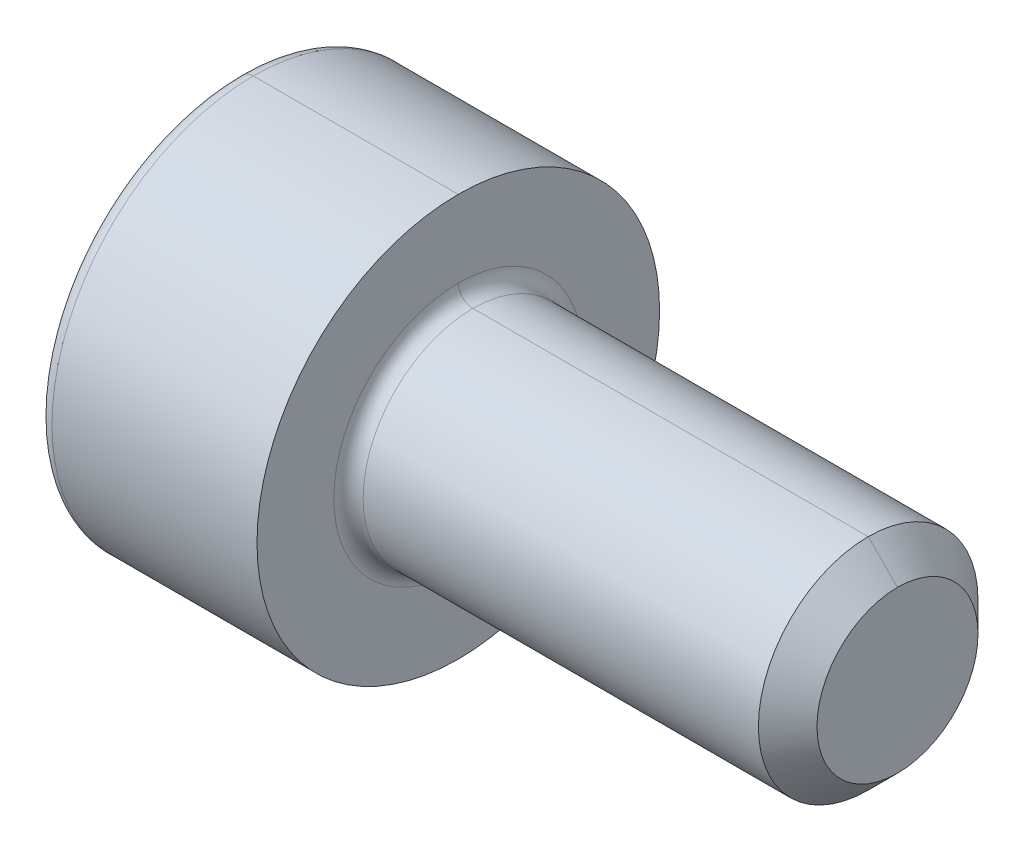
ISO-10303-21;
HEADER;
FILE_DESCRIPTION(('STEP AP214'),'2;1');
FILE_NAME('part.step','',(''),(''),'','','');
FILE_SCHEMA(('AUTOMOTIVE_DESIGN { 1 0 10303 214 1 1 1 1 }'));
ENDSEC;
DATA;
#1=APPLICATION_CONTEXT('core data for automotive mechanical design processes');
#2=APPLICATION_PROTOCOL_DEFINITION('international standard','automotive_design',2000,#1);
#3=PRODUCT_CONTEXT('',#1,'mechanical');
#4=PRODUCT('Part','Part','',(#3));
#5=PRODUCT_RELATED_PRODUCT_CATEGORY('part','',(#4));
#6=PRODUCT_DEFINITION_FORMATION('','',#4);
#7=PRODUCT_DEFINITION_CONTEXT('part definition',#1,'design');
#8=PRODUCT_DEFINITION('design','',#6,#7);
#9=PRODUCT_DEFINITION_SHAPE('','',#8);
#10=(LENGTH_UNIT() NAMED_UNIT(*) SI_UNIT(.MILLI.,.METRE.));
#11=(NAMED_UNIT(*) PLANE_ANGLE_UNIT() SI_UNIT($,.RADIAN.));
#12=(NAMED_UNIT(*) SI_UNIT($,.STERADIAN.) SOLID_ANGLE_UNIT());
#13=UNCERTAINTY_MEASURE_WITH_UNIT(LENGTH_MEASURE(1.E-05),#10,'distance_accuracy_value','');
#14=(GEOMETRIC_REPRESENTATION_CONTEXT(3) GLOBAL_UNCERTAINTY_ASSIGNED_CONTEXT((#13)) GLOBAL_UNIT_ASSIGNED_CONTEXT((#10,
#11,#12)) REPRESENTATION_CONTEXT('',''));
#15=CARTESIAN_POINT('',(0.,0.,0.));
#16=DIRECTION('',(0.,0.,1.));
#17=DIRECTION('',(1.,0.,0.));
#18=AXIS2_PLACEMENT_3D('',#15,#16,#17);
#19=CARTESIAN_POINT('',(1.5,0.,0.));
#20=DIRECTION('',(-1.,0.,0.));
#21=DIRECTION('',(0.,1.,0.));
#22=AXIS2_PLACEMENT_3D('',#19,#20,#21);
#23=PLANE('',#22);
#24=DIRECTION('',(0.,-0.866025403784438,0.5));
#25=VECTOR('',#24,1.);
#26=CARTESIAN_POINT('',(1.5,0.,-1.44337567297406));
#27=LINE('',#26,#25);
#28=CARTESIAN_POINT('',(1.5,0.,-1.44337567297406));
#29=VERTEX_POINT('',#28);
#30=CARTESIAN_POINT('',(1.5,-1.25,-0.721687836487032));
#31=VERTEX_POINT('',#30);
#32=EDGE_CURVE('E286',#29,#31,#27,.T.);
#33=ORIENTED_EDGE('',*,*,#32,.T.);
#34=DIRECTION('',(0.,0.,1.));
#35=VECTOR('',#34,1.);
#36=CARTESIAN_POINT('',(1.5,-1.25,-0.721687836487032));
#37=LINE('',#36,#35);
#38=CARTESIAN_POINT('',(1.5,-1.25,0.721687836487032));
#39=VERTEX_POINT('',#38);
#40=EDGE_CURVE('E11',#31,#39,#37,.T.);
#41=ORIENTED_EDGE('',*,*,#40,.T.);
#42=DIRECTION('',(0.,0.866025403784439,0.5));
#43=VECTOR('',#42,1.);
#44=CARTESIAN_POINT('',(1.5,-1.25,0.721687836487032));
#45=LINE('',#44,#43);
#46=CARTESIAN_POINT('',(1.5,0.,1.44337567297406));
#47=VERTEX_POINT('',#46);
#48=EDGE_CURVE('E45',#39,#47,#45,.T.);
#49=ORIENTED_EDGE('',*,*,#48,.T.);
#50=DIRECTION('',(0.,0.866025403784438,-0.5));
#51=VECTOR('',#50,1.);
#52=CARTESIAN_POINT('',(1.5,0.,1.44337567297406));
#53=LINE('',#52,#51);
#54=CARTESIAN_POINT('',(1.5,1.25,0.721687836487032));
#55=VERTEX_POINT('',#54);
#56=EDGE_CURVE('E196',#47,#55,#53,.T.);
#57=ORIENTED_EDGE('',*,*,#56,.T.);
#58=DIRECTION('',(0.,0.,-1.));
#59=VECTOR('',#58,1.);
#60=CARTESIAN_POINT('',(1.5,1.25,0.721687836487032));
#61=LINE('',#60,#59);
#62=CARTESIAN_POINT('',(1.5,1.25,-0.721687836487032));
#63=VERTEX_POINT('',#62);
#64=EDGE_CURVE('E232',#55,#63,#61,.T.);
#65=ORIENTED_EDGE('',*,*,#64,.T.);
#66=DIRECTION('',(0.,-0.866025403784439,-0.5));
#67=VECTOR('',#66,1.);
#68=CARTESIAN_POINT('',(1.5,1.25,-0.721687836487032));
#69=LINE('',#68,#67);
#70=EDGE_CURVE('E233',#63,#29,#69,.T.);
#71=ORIENTED_EDGE('',*,*,#70,.T.);
#72=EDGE_LOOP('',(#33,#41,#49,#57,#65,#71));
#73=FACE_BOUND('',#72,.T.);
#74=ADVANCED_FACE('F17',(#73),#23,.T.);
#75=CARTESIAN_POINT('',(1.5,-1.25,-0.721687836487032));
#76=DIRECTION('',(0.,-1.,0.));
#77=DIRECTION('',(0.,0.,-1.));
#78=AXIS2_PLACEMENT_3D('',#75,#76,#77);
#79=PLANE('',#78);
#80=DIRECTION('',(0.,0.,1.));
#81=VECTOR('',#80,1.);
#82=CARTESIAN_POINT('',(0.,-1.25,-0.721687836487032));
#83=LINE('',#82,#81);
#84=CARTESIAN_POINT('',(0.,-1.25,-0.721687836487032));
#85=VERTEX_POINT('',#84);
#86=CARTESIAN_POINT('',(0.,-1.25,0.721687836487032));
#87=VERTEX_POINT('',#86);
#88=EDGE_CURVE('E159',#85,#87,#83,.T.);
#89=ORIENTED_EDGE('',*,*,#88,.T.);
#90=DIRECTION('',(-1.,0.,0.));
#91=VECTOR('',#90,1.);
#92=CARTESIAN_POINT('',(1.5,-1.25,0.721687836487032));
#93=LINE('',#92,#91);
#94=EDGE_CURVE('E20',#39,#87,#93,.T.);
#95=ORIENTED_EDGE('',*,*,#94,.F.);
#96=ORIENTED_EDGE('',*,*,#40,.F.);
#97=DIRECTION('',(-1.,0.,0.));
#98=VECTOR('',#97,1.);
#99=CARTESIAN_POINT('',(1.5,-1.25,-0.721687836487032));
#100=LINE('',#99,#98);
#101=EDGE_CURVE('E283',#31,#85,#100,.T.);
#102=ORIENTED_EDGE('',*,*,#101,.T.);
#103=EDGE_LOOP('',(#89,#95,#96,#102));
#104=FACE_BOUND('',#103,.T.);
#105=ADVANCED_FACE('F313',(#104),#79,.F.);
#106=CARTESIAN_POINT('',(1.5,-1.25,0.721687836487032));
#107=DIRECTION('',(0.,-0.5,0.866025403784439));
#108=DIRECTION('',(-1.,0.,0.));
#109=AXIS2_PLACEMENT_3D('',#106,#107,#108);
#110=PLANE('',#109);
#111=DIRECTION('',(0.,0.866025403784439,0.5));
#112=VECTOR('',#111,1.);
#113=CARTESIAN_POINT('',(0.,-1.25,0.721687836487032));
#114=LINE('',#113,#112);
#115=CARTESIAN_POINT('',(0.,0.,1.44337567297406));
#116=VERTEX_POINT('',#115);
#117=EDGE_CURVE('E265',#87,#116,#114,.T.);
#118=ORIENTED_EDGE('',*,*,#117,.T.);
#119=DIRECTION('',(-1.,0.,0.));
#120=VECTOR('',#119,1.);
#121=CARTESIAN_POINT('',(1.5,0.,1.44337567297406));
#122=LINE('',#121,#120);
#123=EDGE_CURVE('E194',#47,#116,#122,.T.);
#124=ORIENTED_EDGE('',*,*,#123,.F.);
#125=ORIENTED_EDGE('',*,*,#48,.F.);
#126=ORIENTED_EDGE('',*,*,#94,.T.);
#127=EDGE_LOOP('',(#118,#124,#125,#126));
#128=FACE_BOUND('',#127,.T.);
#129=ADVANCED_FACE('F308',(#128),#110,.F.);
#130=CARTESIAN_POINT('',(1.5,0.,1.44337567297406));
#131=DIRECTION('',(0.,0.5,0.866025403784438));
#132=DIRECTION('',(1.,0.,0.));
#133=AXIS2_PLACEMENT_3D('',#130,#131,#132);
#134=PLANE('',#133);
#135=DIRECTION('',(0.,0.866025403784438,-0.5));
#136=VECTOR('',#135,1.);
#137=CARTESIAN_POINT('',(0.,0.,1.44337567297406));
#138=LINE('',#137,#136);
#139=CARTESIAN_POINT('',(0.,1.25,0.721687836487032));
#140=VERTEX_POINT('',#139);
#141=EDGE_CURVE('E261',#116,#140,#138,.T.);
#142=ORIENTED_EDGE('',*,*,#141,.T.);
#143=DIRECTION('',(-1.,0.,0.));
#144=VECTOR('',#143,1.);
#145=CARTESIAN_POINT('',(1.5,1.25,0.721687836487032));
#146=LINE('',#145,#144);
#147=EDGE_CURVE('E295',#55,#140,#146,.T.);
#148=ORIENTED_EDGE('',*,*,#147,.F.);
#149=ORIENTED_EDGE('',*,*,#56,.F.);
#150=ORIENTED_EDGE('',*,*,#123,.T.);
#151=EDGE_LOOP('',(#142,#148,#149,#150));
#152=FACE_BOUND('',#151,.T.);
#153=ADVANCED_FACE('F323',(#152),#134,.F.);
#154=CARTESIAN_POINT('',(1.5,1.25,0.721687836487032));
#155=DIRECTION('',(0.,1.,0.));
#156=DIRECTION('',(1.,0.,0.));
#157=AXIS2_PLACEMENT_3D('',#154,#155,#156);
#158=PLANE('',#157);
#159=DIRECTION('',(0.,0.,-1.));
#160=VECTOR('',#159,1.);
#161=CARTESIAN_POINT('',(0.,1.25,0.721687836487032));
#162=LINE('',#161,#160);
#163=CARTESIAN_POINT('',(0.,1.25,-0.721687836487032));
#164=VERTEX_POINT('',#163);
#165=EDGE_CURVE('E257',#140,#164,#162,.T.);
#166=ORIENTED_EDGE('',*,*,#165,.T.);
#167=DIRECTION('',(-1.,0.,0.));
#168=VECTOR('',#167,1.);
#169=CARTESIAN_POINT('',(1.5,1.25,-0.721687836487032));
#170=LINE('',#169,#168);
#171=EDGE_CURVE('E229',#63,#164,#170,.T.);
#172=ORIENTED_EDGE('',*,*,#171,.F.);
#173=ORIENTED_EDGE('',*,*,#64,.F.);
#174=ORIENTED_EDGE('',*,*,#147,.T.);
#175=EDGE_LOOP('',(#166,#172,#173,#174));
#176=FACE_BOUND('',#175,.T.);
#177=ADVANCED_FACE('F330',(#176),#158,.F.);
#178=CARTESIAN_POINT('',(1.5,1.25,-0.721687836487032));
#179=DIRECTION('',(0.,0.5,-0.866025403784439));
#180=DIRECTION('',(-1.,0.,0.));
#181=AXIS2_PLACEMENT_3D('',#178,#179,#180);
#182=PLANE('',#181);
#183=DIRECTION('',(0.,-0.866025403784439,-0.5));
#184=VECTOR('',#183,1.);
#185=CARTESIAN_POINT('',(0.,1.25,-0.721687836487032));
#186=LINE('',#185,#184);
#187=CARTESIAN_POINT('',(0.,0.,-1.44337567297406));
#188=VERTEX_POINT('',#187);
#189=EDGE_CURVE('E253',#164,#188,#186,.T.);
#190=ORIENTED_EDGE('',*,*,#189,.T.);
#191=DIRECTION('',(-1.,0.,0.));
#192=VECTOR('',#191,1.);
#193=CARTESIAN_POINT('',(1.5,0.,-1.44337567297406));
#194=LINE('',#193,#192);
#195=EDGE_CURVE('E289',#29,#188,#194,.T.);
#196=ORIENTED_EDGE('',*,*,#195,.F.);
#197=ORIENTED_EDGE('',*,*,#70,.F.);
#198=ORIENTED_EDGE('',*,*,#171,.T.);
#199=EDGE_LOOP('',(#190,#196,#197,#198));
#200=FACE_BOUND('',#199,.T.);
#201=ADVANCED_FACE('F332',(#200),#182,.F.);
#202=CARTESIAN_POINT('',(1.5,0.,-1.44337567297406));
#203=DIRECTION('',(0.,-0.5,-0.866025403784438));
#204=DIRECTION('',(0.,-0.866025403784438,0.5));
#205=AXIS2_PLACEMENT_3D('',#202,#203,#204);
#206=PLANE('',#205);
#207=DIRECTION('',(0.,-0.866025403784438,0.5));
#208=VECTOR('',#207,1.);
#209=CARTESIAN_POINT('',(0.,0.,-1.44337567297406));
#210=LINE('',#209,#208);
#211=EDGE_CURVE('E249',#188,#85,#210,.T.);
#212=ORIENTED_EDGE('',*,*,#211,.T.);
#213=ORIENTED_EDGE('',*,*,#101,.F.);
#214=ORIENTED_EDGE('',*,*,#32,.F.);
#215=ORIENTED_EDGE('',*,*,#195,.T.);
#216=EDGE_LOOP('',(#212,#213,#214,#215));
#217=FACE_BOUND('',#216,.T.);
#218=ADVANCED_FACE('F335',(#217),#206,.F.);
#219=CARTESIAN_POINT('',(9.,1.1,0.));
#220=DIRECTION('',(1.,0.,0.));
#221=DIRECTION('',(0.,-1.,0.));
#222=AXIS2_PLACEMENT_3D('',#219,#220,#221);
#223=PLANE('',#222);
#224=CARTESIAN_POINT('',(9.,0.,0.));
#225=DIRECTION('',(1.,0.,0.));
#226=DIRECTION('',(0.,1.,0.));
#227=AXIS2_PLACEMENT_3D('',#224,#225,#226);
#228=CIRCLE('',#227,1.1);
#229=CARTESIAN_POINT('',(9.,-1.1,0.));
#230=VERTEX_POINT('',#229);
#231=CARTESIAN_POINT('',(9.,1.1,0.));
#232=VERTEX_POINT('',#231);
#233=EDGE_CURVE('E280',#230,#232,#228,.T.);
#234=ORIENTED_EDGE('',*,*,#233,.T.);
#235=CARTESIAN_POINT('',(9.,0.,0.));
#236=DIRECTION('',(1.,0.,0.));
#237=DIRECTION('',(0.,1.,0.));
#238=AXIS2_PLACEMENT_3D('',#235,#236,#237);
#239=CIRCLE('',#238,1.1);
#240=EDGE_CURVE('E203',#232,#230,#239,.T.);
#241=ORIENTED_EDGE('',*,*,#240,.T.);
#242=EDGE_LOOP('',(#234,#241));
#243=FACE_BOUND('',#242,.T.);
#244=ADVANCED_FACE('F337',(#243),#223,.T.);
#245=CARTESIAN_POINT('',(9.,0.,0.));
#246=DIRECTION('',(-1.,0.,0.));
#247=DIRECTION('',(0.,-1.,0.));
#248=AXIS2_PLACEMENT_3D('',#245,#246,#247);
#249=CONICAL_SURFACE('',#248,1.1,0.785398163397449);
#250=DIRECTION('',(-0.707106781186547,0.707106781186548,0.));
#251=VECTOR('',#250,1.);
#252=CARTESIAN_POINT('',(9.,1.1,0.));
#253=LINE('',#252,#251);
#254=CARTESIAN_POINT('',(8.6,1.5,0.));
#255=VERTEX_POINT('',#254);
#256=EDGE_CURVE('E207',#232,#255,#253,.T.);
#257=ORIENTED_EDGE('',*,*,#256,.F.);
#258=ORIENTED_EDGE('',*,*,#233,.F.);
#259=DIRECTION('',(-0.707106781186547,-0.707106781186548,0.));
#260=VECTOR('',#259,1.);
#261=CARTESIAN_POINT('',(9.,-1.1,0.));
#262=LINE('',#261,#260);
#263=CARTESIAN_POINT('',(8.6,-1.5,0.));
#264=VERTEX_POINT('',#263);
#265=EDGE_CURVE('E217',#230,#264,#262,.T.);
#266=ORIENTED_EDGE('',*,*,#265,.T.);
#267=CARTESIAN_POINT('',(8.6,0.,0.));
#268=DIRECTION('',(1.,0.,0.));
#269=DIRECTION('',(0.,1.,0.));
#270=AXIS2_PLACEMENT_3D('',#267,#268,#269);
#271=CIRCLE('',#270,1.5);
#272=EDGE_CURVE('E277',#264,#255,#271,.T.);
#273=ORIENTED_EDGE('',*,*,#272,.T.);
#274=EDGE_LOOP('',(#257,#258,#266,#273));
#275=FACE_BOUND('',#274,.T.);
#276=ADVANCED_FACE('F344',(#275),#249,.T.);
#277=CARTESIAN_POINT('',(9.,0.,0.));
#278=DIRECTION('',(1.,0.,0.));
#279=DIRECTION('',(0.,1.,0.));
#280=AXIS2_PLACEMENT_3D('',#277,#278,#279);
#281=CYLINDRICAL_SURFACE('',#280,1.5);
#282=DIRECTION('',(1.,0.,0.));
#283=VECTOR('',#282,1.);
#284=CARTESIAN_POINT('',(9.,-1.5,0.));
#285=LINE('',#284,#283);
#286=CARTESIAN_POINT('',(3.2,-1.5,0.));
#287=VERTEX_POINT('',#286);
#288=EDGE_CURVE('E197',#287,#264,#285,.T.);
#289=ORIENTED_EDGE('',*,*,#288,.F.);
#290=CARTESIAN_POINT('',(3.2,0.,0.));
#291=DIRECTION('',(1.,0.,0.));
#292=DIRECTION('',(0.,1.,0.));
#293=AXIS2_PLACEMENT_3D('',#290,#291,#292);
#294=CIRCLE('',#293,1.5);
#295=CARTESIAN_POINT('',(3.2,1.5,0.));
#296=VERTEX_POINT('',#295);
#297=EDGE_CURVE('E218',#287,#296,#294,.T.);
#298=ORIENTED_EDGE('',*,*,#297,.T.);
#299=DIRECTION('',(1.,0.,0.));
#300=VECTOR('',#299,1.);
#301=CARTESIAN_POINT('',(9.,1.5,0.));
#302=LINE('',#301,#300);
#303=EDGE_CURVE('E201',#296,#255,#302,.T.);
#304=ORIENTED_EDGE('',*,*,#303,.T.);
#305=ORIENTED_EDGE('',*,*,#272,.F.);
#306=EDGE_LOOP('',(#289,#298,#304,#305));
#307=FACE_BOUND('',#306,.T.);
#308=ADVANCED_FACE('F381',(#307),#281,.T.);
#309=CARTESIAN_POINT('',(3.2,0.,0.));
#310=DIRECTION('',(1.,0.,0.));
#311=DIRECTION('',(0.,1.,0.));
#312=AXIS2_PLACEMENT_3D('',#309,#310,#311);
#313=TOROIDAL_SURFACE('',#312,1.7,0.2);
#314=CARTESIAN_POINT('',(3.2,-1.7,0.));
#315=DIRECTION('',(0.,0.,1.));
#316=DIRECTION('',(0.,-1.,0.));
#317=AXIS2_PLACEMENT_3D('',#314,#315,#316);
#318=CIRCLE('',#317,0.2);
#319=CARTESIAN_POINT('',(3.,-1.7,0.));
#320=VERTEX_POINT('',#319);
#321=EDGE_CURVE('E221',#287,#320,#318,.T.);
#322=ORIENTED_EDGE('',*,*,#321,.F.);
#323=CARTESIAN_POINT('',(3.2,0.,0.));
#324=DIRECTION('',(1.,0.,0.));
#325=DIRECTION('',(0.,1.,0.));
#326=AXIS2_PLACEMENT_3D('',#323,#324,#325);
#327=CIRCLE('',#326,1.5);
#328=EDGE_CURVE('E202',#296,#287,#327,.T.);
#329=ORIENTED_EDGE('',*,*,#328,.F.);
#330=CARTESIAN_POINT('',(3.2,1.7,0.));
#331=DIRECTION('',(0.,0.,-1.));
#332=DIRECTION('',(-1.,0.,0.));
#333=AXIS2_PLACEMENT_3D('',#330,#331,#332);
#334=CIRCLE('',#333,0.2);
#335=CARTESIAN_POINT('',(3.,1.7,0.));
#336=VERTEX_POINT('',#335);
#337=EDGE_CURVE('E182',#296,#336,#334,.T.);
#338=ORIENTED_EDGE('',*,*,#337,.T.);
#339=CARTESIAN_POINT('',(3.,0.,0.));
#340=DIRECTION('',(1.,0.,0.));
#341=DIRECTION('',(0.,1.,0.));
#342=AXIS2_PLACEMENT_3D('',#339,#340,#341);
#343=CIRCLE('',#342,1.7);
#344=EDGE_CURVE('E274',#336,#320,#343,.T.);
#345=ORIENTED_EDGE('',*,*,#344,.T.);
#346=EDGE_LOOP('',(#322,#329,#338,#345));
#347=FACE_BOUND('',#346,.T.);
#348=ADVANCED_FACE('F374',(#347),#313,.F.);
#349=CARTESIAN_POINT('',(3.,2.75,0.));
#350=DIRECTION('',(1.,0.,0.));
#351=DIRECTION('',(0.,-1.,0.));
#352=AXIS2_PLACEMENT_3D('',#349,#350,#351);
#353=PLANE('',#352);
#354=ORIENTED_EDGE('',*,*,#344,.F.);
#355=CARTESIAN_POINT('',(3.,0.,0.));
#356=DIRECTION('',(1.,0.,0.));
#357=DIRECTION('',(0.,1.,0.));
#358=AXIS2_PLACEMENT_3D('',#355,#356,#357);
#359=CIRCLE('',#358,1.7);
#360=EDGE_CURVE('E191',#320,#336,#359,.T.);
#361=ORIENTED_EDGE('',*,*,#360,.F.);
#362=EDGE_LOOP('',(#354,#361));
#363=FACE_BOUND('',#362,.T.);
#364=CARTESIAN_POINT('',(3.,0.,0.));
#365=DIRECTION('',(1.,0.,0.));
#366=DIRECTION('',(0.,1.,0.));
#367=AXIS2_PLACEMENT_3D('',#364,#365,#366);
#368=CIRCLE('',#367,2.75);
#369=CARTESIAN_POINT('',(3.,2.75,0.));
#370=VERTEX_POINT('',#369);
#371=CARTESIAN_POINT('',(3.,-2.75,0.));
#372=VERTEX_POINT('',#371);
#373=EDGE_CURVE('E176',#370,#372,#368,.T.);
#374=ORIENTED_EDGE('',*,*,#373,.T.);
#375=CARTESIAN_POINT('',(3.,0.,0.));
#376=DIRECTION('',(1.,0.,0.));
#377=DIRECTION('',(0.,1.,0.));
#378=AXIS2_PLACEMENT_3D('',#375,#376,#377);
#379=CIRCLE('',#378,2.75);
#380=EDGE_CURVE('E158',#372,#370,#379,.T.);
#381=ORIENTED_EDGE('',*,*,#380,.T.);
#382=EDGE_LOOP('',(#374,#381));
#383=FACE_BOUND('',#382,.T.);
#384=ADVANCED_FACE('F371',(#363,#383),#353,.T.);
#385=CARTESIAN_POINT('',(9.,0.,0.));
#386=DIRECTION('',(1.,0.,0.));
#387=DIRECTION('',(0.,1.,0.));
#388=AXIS2_PLACEMENT_3D('',#385,#386,#387);
#389=CYLINDRICAL_SURFACE('',#388,2.75);
#390=DIRECTION('',(1.,0.,0.));
#391=VECTOR('',#390,1.);
#392=CARTESIAN_POINT('',(9.,-2.75,0.));
#393=LINE('',#392,#391);
#394=CARTESIAN_POINT('',(0.2,-2.75,0.));
#395=VERTEX_POINT('',#394);
#396=EDGE_CURVE('E152',#395,#372,#393,.T.);
#397=ORIENTED_EDGE('',*,*,#396,.F.);
#398=CARTESIAN_POINT('',(0.2,0.,0.));
#399=DIRECTION('',(1.,0.,0.));
#400=DIRECTION('',(0.,1.,0.));
#401=AXIS2_PLACEMENT_3D('',#398,#399,#400);
#402=CIRCLE('',#401,2.75);
#403=CARTESIAN_POINT('',(0.2,2.75,0.));
#404=VERTEX_POINT('',#403);
#405=EDGE_CURVE('E145',#395,#404,#402,.T.);
#406=ORIENTED_EDGE('',*,*,#405,.T.);
#407=DIRECTION('',(1.,0.,0.));
#408=VECTOR('',#407,1.);
#409=CARTESIAN_POINT('',(9.,2.75,0.));
#410=LINE('',#409,#408);
#411=EDGE_CURVE('E149',#404,#370,#410,.T.);
#412=ORIENTED_EDGE('',*,*,#411,.T.);
#413=ORIENTED_EDGE('',*,*,#380,.F.);
#414=EDGE_LOOP('',(#397,#406,#412,#413));
#415=FACE_BOUND('',#414,.T.);
#416=ADVANCED_FACE('F147',(#415),#389,.T.);
#417=CARTESIAN_POINT('',(0.2,0.,0.));
#418=DIRECTION('',(1.,0.,0.));
#419=DIRECTION('',(0.,1.,0.));
#420=AXIS2_PLACEMENT_3D('',#417,#418,#419);
#421=TOROIDAL_SURFACE('',#420,2.55,0.2);
#422=CARTESIAN_POINT('',(0.2,-2.55,0.));
#423=DIRECTION('',(0.,0.,1.));
#424=DIRECTION('',(0.,-1.,0.));
#425=AXIS2_PLACEMENT_3D('',#422,#423,#424);
#426=CIRCLE('',#425,0.2);
#427=CARTESIAN_POINT('',(0.,-2.55,0.));
#428=VERTEX_POINT('',#427);
#429=EDGE_CURVE('E170',#428,#395,#426,.T.);
#430=ORIENTED_EDGE('',*,*,#429,.F.);
#431=CARTESIAN_POINT('',(0.,0.,0.));
#432=DIRECTION('',(1.,0.,0.));
#433=DIRECTION('',(0.,1.,0.));
#434=AXIS2_PLACEMENT_3D('',#431,#432,#433);
#435=CIRCLE('',#434,2.55);
#436=CARTESIAN_POINT('',(0.,2.55,0.));
#437=VERTEX_POINT('',#436);
#438=EDGE_CURVE('E164',#428,#437,#435,.T.);
#439=ORIENTED_EDGE('',*,*,#438,.T.);
#440=CARTESIAN_POINT('',(0.2,2.55,0.));
#441=DIRECTION('',(0.,0.,-1.));
#442=DIRECTION('',(-1.,0.,0.));
#443=AXIS2_PLACEMENT_3D('',#440,#441,#442);
#444=CIRCLE('',#443,0.2);
#445=EDGE_CURVE('E162',#437,#404,#444,.T.);
#446=ORIENTED_EDGE('',*,*,#445,.T.);
#447=ORIENTED_EDGE('',*,*,#405,.F.);
#448=EDGE_LOOP('',(#430,#439,#446,#447));
#449=FACE_BOUND('',#448,.T.);
#450=ADVANCED_FACE('F163',(#449),#421,.T.);
#451=CARTESIAN_POINT('',(0.,0.,0.));
#452=DIRECTION('',(-1.,0.,0.));
#453=DIRECTION('',(0.,0.,1.));
#454=AXIS2_PLACEMENT_3D('',#451,#452,#453);
#455=PLANE('',#454);
#456=ORIENTED_EDGE('',*,*,#211,.F.);
#457=ORIENTED_EDGE('',*,*,#189,.F.);
#458=ORIENTED_EDGE('',*,*,#165,.F.);
#459=ORIENTED_EDGE('',*,*,#141,.F.);
#460=ORIENTED_EDGE('',*,*,#117,.F.);
#461=ORIENTED_EDGE('',*,*,#88,.F.);
#462=EDGE_LOOP('',(#456,#457,#458,#459,#460,#461));
#463=FACE_BOUND('',#462,.T.);
#464=CARTESIAN_POINT('',(0.,0.,0.));
#465=DIRECTION('',(1.,0.,0.));
#466=DIRECTION('',(0.,1.,0.));
#467=AXIS2_PLACEMENT_3D('',#464,#465,#466);
#468=CIRCLE('',#467,2.55);
#469=EDGE_CURVE('E178',#437,#428,#468,.T.);
#470=ORIENTED_EDGE('',*,*,#469,.F.);
#471=ORIENTED_EDGE('',*,*,#438,.F.);
#472=EDGE_LOOP('',(#470,#471));
#473=FACE_BOUND('',#472,.T.);
#474=ADVANCED_FACE('F317',(#463,#473),#455,.T.);
#475=CARTESIAN_POINT('',(0.2,0.,0.));
#476=DIRECTION('',(1.,0.,0.));
#477=DIRECTION('',(0.,1.,0.));
#478=AXIS2_PLACEMENT_3D('',#475,#476,#477);
#479=TOROIDAL_SURFACE('',#478,2.55,0.2);
#480=ORIENTED_EDGE('',*,*,#469,.T.);
#481=ORIENTED_EDGE('',*,*,#429,.T.);
#482=CARTESIAN_POINT('',(0.2,0.,0.));
#483=DIRECTION('',(1.,0.,0.));
#484=DIRECTION('',(0.,1.,0.));
#485=AXIS2_PLACEMENT_3D('',#482,#483,#484);
#486=CIRCLE('',#485,2.75);
#487=EDGE_CURVE('E174',#404,#395,#486,.T.);
#488=ORIENTED_EDGE('',*,*,#487,.F.);
#489=ORIENTED_EDGE('',*,*,#445,.F.);
#490=EDGE_LOOP('',(#480,#481,#488,#489));
#491=FACE_BOUND('',#490,.T.);
#492=ADVANCED_FACE('F180',(#491),#479,.T.);
#493=CARTESIAN_POINT('',(9.,0.,0.));
#494=DIRECTION('',(1.,0.,0.));
#495=DIRECTION('',(0.,1.,0.));
#496=AXIS2_PLACEMENT_3D('',#493,#494,#495);
#497=CYLINDRICAL_SURFACE('',#496,2.75);
#498=ORIENTED_EDGE('',*,*,#487,.T.);
#499=ORIENTED_EDGE('',*,*,#396,.T.);
#500=ORIENTED_EDGE('',*,*,#373,.F.);
#501=ORIENTED_EDGE('',*,*,#411,.F.);
#502=EDGE_LOOP('',(#498,#499,#500,#501));
#503=FACE_BOUND('',#502,.T.);
#504=ADVANCED_FACE('F173',(#503),#497,.T.);
#505=CARTESIAN_POINT('',(3.2,0.,0.));
#506=DIRECTION('',(1.,0.,0.));
#507=DIRECTION('',(0.,1.,0.));
#508=AXIS2_PLACEMENT_3D('',#505,#506,#507);
#509=TOROIDAL_SURFACE('',#508,1.7,0.2);
#510=ORIENTED_EDGE('',*,*,#297,.F.);
#511=ORIENTED_EDGE('',*,*,#321,.T.);
#512=ORIENTED_EDGE('',*,*,#360,.T.);
#513=ORIENTED_EDGE('',*,*,#337,.F.);
#514=EDGE_LOOP('',(#510,#511,#512,#513));
#515=FACE_BOUND('',#514,.T.);
#516=ADVANCED_FACE('F378',(#515),#509,.F.);
#517=CARTESIAN_POINT('',(9.,0.,0.));
#518=DIRECTION('',(1.,0.,0.));
#519=DIRECTION('',(0.,1.,0.));
#520=AXIS2_PLACEMENT_3D('',#517,#518,#519);
#521=CYLINDRICAL_SURFACE('',#520,1.5);
#522=ORIENTED_EDGE('',*,*,#328,.T.);
#523=ORIENTED_EDGE('',*,*,#288,.T.);
#524=CARTESIAN_POINT('',(8.6,0.,0.));
#525=DIRECTION('',(1.,0.,0.));
#526=DIRECTION('',(0.,1.,0.));
#527=AXIS2_PLACEMENT_3D('',#524,#525,#526);
#528=CIRCLE('',#527,1.5);
#529=EDGE_CURVE('E213',#255,#264,#528,.T.);
#530=ORIENTED_EDGE('',*,*,#529,.F.);
#531=ORIENTED_EDGE('',*,*,#303,.F.);
#532=EDGE_LOOP('',(#522,#523,#530,#531));
#533=FACE_BOUND('',#532,.T.);
#534=ADVANCED_FACE('F396',(#533),#521,.T.);
#535=CARTESIAN_POINT('',(9.,0.,0.));
#536=DIRECTION('',(-1.,0.,0.));
#537=DIRECTION('',(0.,-1.,0.));
#538=AXIS2_PLACEMENT_3D('',#535,#536,#537);
#539=CONICAL_SURFACE('',#538,1.1,0.785398163397449);
#540=ORIENTED_EDGE('',*,*,#240,.F.);
#541=ORIENTED_EDGE('',*,*,#256,.T.);
#542=ORIENTED_EDGE('',*,*,#529,.T.);
#543=ORIENTED_EDGE('',*,*,#265,.F.);
#544=EDGE_LOOP('',(#540,#541,#542,#543));
#545=FACE_BOUND('',#544,.T.);
#546=ADVANCED_FACE('F404',(#545),#539,.T.);
#547=CLOSED_SHELL('',(#74,#105,#129,#153,#177,#201,#218,#244,#276,#308,#348,#384,#416,#450,#474,
#492,#504,#516,#534,#546));
#548=MANIFOLD_SOLID_BREP('B1',#547);
#549=ADVANCED_BREP_SHAPE_REPRESENTATION('',(#18,#548),#14);
#550=SHAPE_DEFINITION_REPRESENTATION(#9,#549);
ENDSEC;
END-ISO-10303-21;
